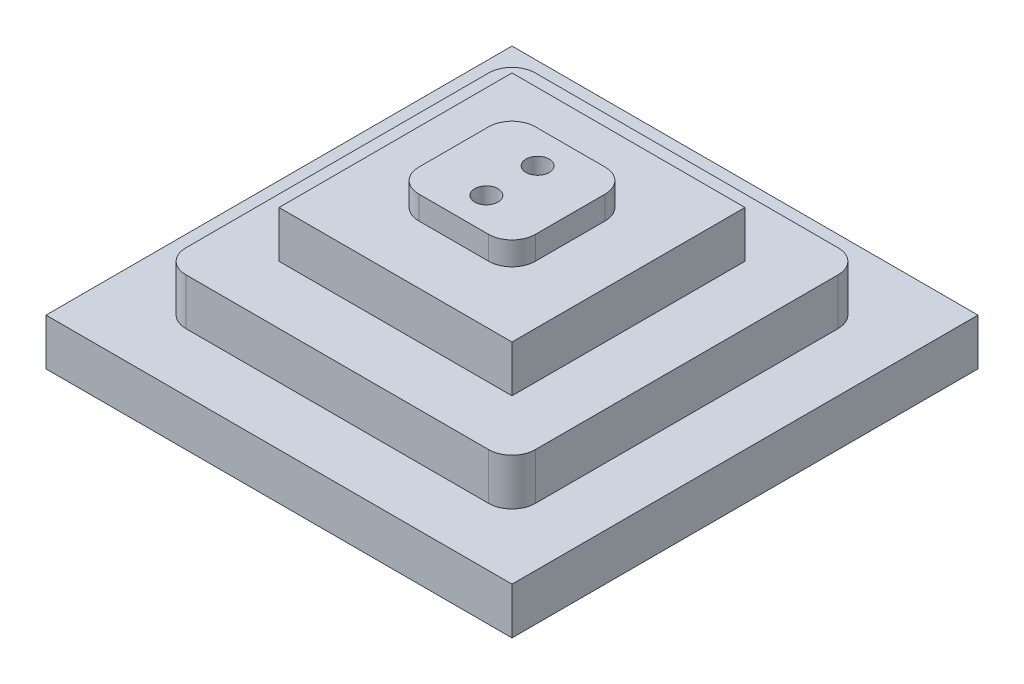
ISO-10303-21;
HEADER;
FILE_DESCRIPTION(('STEP AP214'),'2;1');
FILE_NAME('part.step','',(''),(''),'','','');
FILE_SCHEMA(('AUTOMOTIVE_DESIGN { 1 0 10303 214 1 1 1 1 }'));
ENDSEC;
DATA;
#1=APPLICATION_CONTEXT('core data for automotive mechanical design processes');
#2=APPLICATION_PROTOCOL_DEFINITION('international standard','automotive_design',2000,#1);
#3=PRODUCT_CONTEXT('',#1,'mechanical');
#4=PRODUCT('Part','Part','',(#3));
#5=PRODUCT_RELATED_PRODUCT_CATEGORY('part','',(#4));
#6=PRODUCT_DEFINITION_FORMATION('','',#4);
#7=PRODUCT_DEFINITION_CONTEXT('part definition',#1,'design');
#8=PRODUCT_DEFINITION('design','',#6,#7);
#9=PRODUCT_DEFINITION_SHAPE('','',#8);
#10=(LENGTH_UNIT() NAMED_UNIT(*) SI_UNIT(.MILLI.,.METRE.));
#11=(NAMED_UNIT(*) PLANE_ANGLE_UNIT() SI_UNIT($,.RADIAN.));
#12=(NAMED_UNIT(*) SI_UNIT($,.STERADIAN.) SOLID_ANGLE_UNIT());
#13=UNCERTAINTY_MEASURE_WITH_UNIT(LENGTH_MEASURE(1.E-05),#10,'distance_accuracy_value','');
#14=(GEOMETRIC_REPRESENTATION_CONTEXT(3) GLOBAL_UNCERTAINTY_ASSIGNED_CONTEXT((#13)) GLOBAL_UNIT_ASSIGNED_CONTEXT((#10,
#11,#12)) REPRESENTATION_CONTEXT('',''));
#15=CARTESIAN_POINT('',(0.,0.,0.));
#16=DIRECTION('',(0.,0.,1.));
#17=DIRECTION('',(1.,0.,0.));
#18=AXIS2_PLACEMENT_3D('',#15,#16,#17);
#19=CARTESIAN_POINT('',(0.,10.,0.));
#20=DIRECTION('',(0.,-1.,0.));
#21=DIRECTION('',(0.,0.,-1.));
#22=AXIS2_PLACEMENT_3D('',#19,#20,#21);
#23=PLANE('',#22);
#24=DIRECTION('',(0.,0.,1.));
#25=VECTOR('',#24,1.);
#26=CARTESIAN_POINT('',(0.,10.,0.));
#27=LINE('',#26,#25);
#28=CARTESIAN_POINT('',(0.,10.,-100.));
#29=VERTEX_POINT('',#28);
#30=CARTESIAN_POINT('',(0.,10.,0.));
#31=VERTEX_POINT('',#30);
#32=EDGE_CURVE('E267',#29,#31,#27,.T.);
#33=ORIENTED_EDGE('',*,*,#32,.T.);
#34=DIRECTION('',(1.,0.,0.));
#35=VECTOR('',#34,1.);
#36=CARTESIAN_POINT('',(0.,10.,0.));
#37=LINE('',#36,#35);
#38=CARTESIAN_POINT('',(100.,10.,0.));
#39=VERTEX_POINT('',#38);
#40=EDGE_CURVE('E271',#31,#39,#37,.T.);
#41=ORIENTED_EDGE('',*,*,#40,.T.);
#42=DIRECTION('',(0.,0.,-1.));
#43=VECTOR('',#42,1.);
#44=CARTESIAN_POINT('',(100.,10.,0.));
#45=LINE('',#44,#43);
#46=CARTESIAN_POINT('',(100.,10.,-100.));
#47=VERTEX_POINT('',#46);
#48=EDGE_CURVE('E275',#39,#47,#45,.T.);
#49=ORIENTED_EDGE('',*,*,#48,.T.);
#50=DIRECTION('',(-1.,0.,0.));
#51=VECTOR('',#50,1.);
#52=CARTESIAN_POINT('',(0.,10.,-100.));
#53=LINE('',#52,#51);
#54=EDGE_CURVE('E278',#47,#29,#53,.T.);
#55=ORIENTED_EDGE('',*,*,#54,.T.);
#56=EDGE_LOOP('',(#33,#41,#49,#55));
#57=FACE_BOUND('',#56,.T.);
#58=DIRECTION('',(0.,0.,1.));
#59=VECTOR('',#58,1.);
#60=CARTESIAN_POINT('',(12.5,10.,-12.5));
#61=LINE('',#60,#59);
#62=CARTESIAN_POINT('',(12.5,10.,-82.5));
#63=VERTEX_POINT('',#62);
#64=CARTESIAN_POINT('',(12.5,10.,-17.5));
#65=VERTEX_POINT('',#64);
#66=EDGE_CURVE('E228',#63,#65,#61,.T.);
#67=ORIENTED_EDGE('',*,*,#66,.F.);
#68=CARTESIAN_POINT('',(17.5,10.,-82.5));
#69=DIRECTION('',(0.,-1.,0.));
#70=DIRECTION('',(0.,0.,-1.));
#71=AXIS2_PLACEMENT_3D('',#68,#69,#70);
#72=CIRCLE('',#71,5.);
#73=CARTESIAN_POINT('',(17.5,10.,-87.5));
#74=VERTEX_POINT('',#73);
#75=EDGE_CURVE('E387',#63,#74,#72,.T.);
#76=ORIENTED_EDGE('',*,*,#75,.T.);
#77=DIRECTION('',(-1.,0.,0.));
#78=VECTOR('',#77,1.);
#79=CARTESIAN_POINT('',(87.5,10.,-87.5));
#80=LINE('',#79,#78);
#81=CARTESIAN_POINT('',(82.5,10.,-87.5));
#82=VERTEX_POINT('',#81);
#83=EDGE_CURVE('E244',#82,#74,#80,.T.);
#84=ORIENTED_EDGE('',*,*,#83,.F.);
#85=CARTESIAN_POINT('',(82.5,10.,-82.5));
#86=DIRECTION('',(0.,-1.,0.));
#87=DIRECTION('',(0.,0.,-1.));
#88=AXIS2_PLACEMENT_3D('',#85,#86,#87);
#89=CIRCLE('',#88,5.);
#90=CARTESIAN_POINT('',(87.5,10.,-82.5));
#91=VERTEX_POINT('',#90);
#92=EDGE_CURVE('E402',#82,#91,#89,.T.);
#93=ORIENTED_EDGE('',*,*,#92,.T.);
#94=DIRECTION('',(0.,0.,-1.));
#95=VECTOR('',#94,1.);
#96=CARTESIAN_POINT('',(87.5,10.,-12.5));
#97=LINE('',#96,#95);
#98=CARTESIAN_POINT('',(87.5,10.,-17.5));
#99=VERTEX_POINT('',#98);
#100=EDGE_CURVE('E260',#99,#91,#97,.T.);
#101=ORIENTED_EDGE('',*,*,#100,.F.);
#102=CARTESIAN_POINT('',(82.5,10.,-17.5));
#103=DIRECTION('',(0.,-1.,0.));
#104=DIRECTION('',(0.,0.,-1.));
#105=AXIS2_PLACEMENT_3D('',#102,#103,#104);
#106=CIRCLE('',#105,5.);
#107=CARTESIAN_POINT('',(82.5,10.,-12.5));
#108=VERTEX_POINT('',#107);
#109=EDGE_CURVE('E399',#99,#108,#106,.T.);
#110=ORIENTED_EDGE('',*,*,#109,.T.);
#111=DIRECTION('',(1.,0.,0.));
#112=VECTOR('',#111,1.);
#113=CARTESIAN_POINT('',(87.5,10.,-12.5));
#114=LINE('',#113,#112);
#115=CARTESIAN_POINT('',(17.5,10.,-12.5));
#116=VERTEX_POINT('',#115);
#117=EDGE_CURVE('E233',#116,#108,#114,.T.);
#118=ORIENTED_EDGE('',*,*,#117,.F.);
#119=CARTESIAN_POINT('',(17.5,10.,-17.5));
#120=DIRECTION('',(0.,-1.,0.));
#121=DIRECTION('',(0.,0.,-1.));
#122=AXIS2_PLACEMENT_3D('',#119,#120,#121);
#123=CIRCLE('',#122,5.);
#124=EDGE_CURVE('E396',#116,#65,#123,.T.);
#125=ORIENTED_EDGE('',*,*,#124,.T.);
#126=EDGE_LOOP('',(#67,#76,#84,#93,#101,#110,#118,#125));
#127=FACE_BOUND('',#126,.T.);
#128=ADVANCED_FACE('F39',(#57,#127),#23,.F.);
#129=CARTESIAN_POINT('',(0.,10.,0.));
#130=DIRECTION('',(1.,0.,0.));
#131=DIRECTION('',(0.,0.,-1.));
#132=AXIS2_PLACEMENT_3D('',#129,#130,#131);
#133=PLANE('',#132);
#134=DIRECTION('',(0.,0.,1.));
#135=VECTOR('',#134,1.);
#136=CARTESIAN_POINT('',(0.,0.,0.));
#137=LINE('',#136,#135);
#138=CARTESIAN_POINT('',(0.,0.,-100.));
#139=VERTEX_POINT('',#138);
#140=CARTESIAN_POINT('',(0.,0.,0.));
#141=VERTEX_POINT('',#140);
#142=EDGE_CURVE('E255',#139,#141,#137,.T.);
#143=ORIENTED_EDGE('',*,*,#142,.T.);
#144=DIRECTION('',(0.,-1.,0.));
#145=VECTOR('',#144,1.);
#146=CARTESIAN_POINT('',(0.,10.,0.));
#147=LINE('',#146,#145);
#148=EDGE_CURVE('E304',#31,#141,#147,.T.);
#149=ORIENTED_EDGE('',*,*,#148,.F.);
#150=ORIENTED_EDGE('',*,*,#32,.F.);
#151=DIRECTION('',(0.,-1.,0.));
#152=VECTOR('',#151,1.);
#153=CARTESIAN_POINT('',(0.,10.,-100.));
#154=LINE('',#153,#152);
#155=EDGE_CURVE('E281',#29,#139,#154,.T.);
#156=ORIENTED_EDGE('',*,*,#155,.T.);
#157=EDGE_LOOP('',(#143,#149,#150,#156));
#158=FACE_BOUND('',#157,.T.);
#159=ADVANCED_FACE('F455',(#158),#133,.F.);
#160=CARTESIAN_POINT('',(0.,10.,0.));
#161=DIRECTION('',(0.,0.,-1.));
#162=DIRECTION('',(-1.,0.,0.));
#163=AXIS2_PLACEMENT_3D('',#160,#161,#162);
#164=PLANE('',#163);
#165=DIRECTION('',(1.,0.,0.));
#166=VECTOR('',#165,1.);
#167=CARTESIAN_POINT('',(0.,0.,0.));
#168=LINE('',#167,#166);
#169=CARTESIAN_POINT('',(100.,0.,0.));
#170=VERTEX_POINT('',#169);
#171=EDGE_CURVE('E285',#141,#170,#168,.T.);
#172=ORIENTED_EDGE('',*,*,#171,.T.);
#173=DIRECTION('',(0.,-1.,0.));
#174=VECTOR('',#173,1.);
#175=CARTESIAN_POINT('',(100.,10.,0.));
#176=LINE('',#175,#174);
#177=EDGE_CURVE('E300',#39,#170,#176,.T.);
#178=ORIENTED_EDGE('',*,*,#177,.F.);
#179=ORIENTED_EDGE('',*,*,#40,.F.);
#180=ORIENTED_EDGE('',*,*,#148,.T.);
#181=EDGE_LOOP('',(#172,#178,#179,#180));
#182=FACE_BOUND('',#181,.T.);
#183=ADVANCED_FACE('F461',(#182),#164,.F.);
#184=CARTESIAN_POINT('',(100.,10.,0.));
#185=DIRECTION('',(-1.,0.,0.));
#186=DIRECTION('',(0.,0.,1.));
#187=AXIS2_PLACEMENT_3D('',#184,#185,#186);
#188=PLANE('',#187);
#189=DIRECTION('',(0.,0.,-1.));
#190=VECTOR('',#189,1.);
#191=CARTESIAN_POINT('',(100.,0.,0.));
#192=LINE('',#191,#190);
#193=CARTESIAN_POINT('',(100.,0.,-100.));
#194=VERTEX_POINT('',#193);
#195=EDGE_CURVE('E288',#170,#194,#192,.T.);
#196=ORIENTED_EDGE('',*,*,#195,.T.);
#197=DIRECTION('',(0.,-1.,0.));
#198=VECTOR('',#197,1.);
#199=CARTESIAN_POINT('',(100.,10.,-100.));
#200=LINE('',#199,#198);
#201=EDGE_CURVE('E296',#47,#194,#200,.T.);
#202=ORIENTED_EDGE('',*,*,#201,.F.);
#203=ORIENTED_EDGE('',*,*,#48,.F.);
#204=ORIENTED_EDGE('',*,*,#177,.T.);
#205=EDGE_LOOP('',(#196,#202,#203,#204));
#206=FACE_BOUND('',#205,.T.);
#207=ADVANCED_FACE('F474',(#206),#188,.F.);
#208=CARTESIAN_POINT('',(0.,10.,-100.));
#209=DIRECTION('',(0.,0.,1.));
#210=DIRECTION('',(1.,0.,0.));
#211=AXIS2_PLACEMENT_3D('',#208,#209,#210);
#212=PLANE('',#211);
#213=DIRECTION('',(-1.,0.,0.));
#214=VECTOR('',#213,1.);
#215=CARTESIAN_POINT('',(0.,0.,-100.));
#216=LINE('',#215,#214);
#217=EDGE_CURVE('E272',#194,#139,#216,.T.);
#218=ORIENTED_EDGE('',*,*,#217,.T.);
#219=ORIENTED_EDGE('',*,*,#155,.F.);
#220=ORIENTED_EDGE('',*,*,#54,.F.);
#221=ORIENTED_EDGE('',*,*,#201,.T.);
#222=EDGE_LOOP('',(#218,#219,#220,#221));
#223=FACE_BOUND('',#222,.T.);
#224=ADVANCED_FACE('F470',(#223),#212,.F.);
#225=CARTESIAN_POINT('',(0.,0.,0.));
#226=DIRECTION('',(0.,-1.,0.));
#227=DIRECTION('',(0.,0.,-1.));
#228=AXIS2_PLACEMENT_3D('',#225,#226,#227);
#229=PLANE('',#228);
#230=CARTESIAN_POINT('',(50.,0.,-55.5));
#231=DIRECTION('',(0.,1.,0.));
#232=DIRECTION('',(0.,0.,1.));
#233=AXIS2_PLACEMENT_3D('',#230,#231,#232);
#234=CIRCLE('',#233,1.5);
#235=CARTESIAN_POINT('',(50.,0.,-54.));
#236=VERTEX_POINT('',#235);
#237=EDGE_CURVE('E839',#236,#236,#234,.T.);
#238=ORIENTED_EDGE('',*,*,#237,.T.);
#239=EDGE_LOOP('',(#238));
#240=FACE_BOUND('',#239,.T.);
#241=CARTESIAN_POINT('',(50.,0.,-44.5));
#242=DIRECTION('',(0.,1.,0.));
#243=DIRECTION('',(0.,0.,1.));
#244=AXIS2_PLACEMENT_3D('',#241,#242,#243);
#245=CIRCLE('',#244,1.5);
#246=CARTESIAN_POINT('',(50.,0.,-43.));
#247=VERTEX_POINT('',#246);
#248=EDGE_CURVE('E844',#247,#247,#245,.T.);
#249=ORIENTED_EDGE('',*,*,#248,.T.);
#250=EDGE_LOOP('',(#249));
#251=FACE_BOUND('',#250,.T.);
#252=ORIENTED_EDGE('',*,*,#142,.F.);
#253=ORIENTED_EDGE('',*,*,#217,.F.);
#254=ORIENTED_EDGE('',*,*,#195,.F.);
#255=ORIENTED_EDGE('',*,*,#171,.F.);
#256=EDGE_LOOP('',(#252,#253,#254,#255));
#257=FACE_BOUND('',#256,.T.);
#258=ADVANCED_FACE('F467',(#240,#251,#257),#229,.T.);
#259=CARTESIAN_POINT('',(12.5,20.,-12.5));
#260=DIRECTION('',(1.,0.,0.));
#261=DIRECTION('',(0.,0.,-1.));
#262=AXIS2_PLACEMENT_3D('',#259,#260,#261);
#263=PLANE('',#262);
#264=DIRECTION('',(0.,0.,1.));
#265=VECTOR('',#264,1.);
#266=CARTESIAN_POINT('',(12.5,20.,-12.5));
#267=LINE('',#266,#265);
#268=CARTESIAN_POINT('',(12.5,20.,-82.5));
#269=VERTEX_POINT('',#268);
#270=CARTESIAN_POINT('',(12.5,20.,-17.5));
#271=VERTEX_POINT('',#270);
#272=EDGE_CURVE('E239',#269,#271,#267,.T.);
#273=ORIENTED_EDGE('',*,*,#272,.F.);
#274=DIRECTION('',(0.,-1.,0.));
#275=VECTOR('',#274,1.);
#276=CARTESIAN_POINT('',(12.5,20.,-82.5));
#277=LINE('',#276,#275);
#278=EDGE_CURVE('E311',#269,#63,#277,.T.);
#279=ORIENTED_EDGE('',*,*,#278,.T.);
#280=ORIENTED_EDGE('',*,*,#66,.T.);
#281=DIRECTION('',(0.,-1.,0.));
#282=VECTOR('',#281,1.);
#283=CARTESIAN_POINT('',(12.5,20.,-17.5));
#284=LINE('',#283,#282);
#285=EDGE_CURVE('E308',#65,#271,#284,.F.);
#286=ORIENTED_EDGE('',*,*,#285,.T.);
#287=EDGE_LOOP('',(#273,#279,#280,#286));
#288=FACE_BOUND('',#287,.T.);
#289=ADVANCED_FACE('F431',(#288),#263,.F.);
#290=CARTESIAN_POINT('',(87.5,20.,-12.5));
#291=DIRECTION('',(0.,0.,-1.));
#292=DIRECTION('',(-1.,0.,0.));
#293=AXIS2_PLACEMENT_3D('',#290,#291,#292);
#294=PLANE('',#293);
#295=DIRECTION('',(1.,0.,0.));
#296=VECTOR('',#295,1.);
#297=CARTESIAN_POINT('',(87.5,20.,-12.5));
#298=LINE('',#297,#296);
#299=CARTESIAN_POINT('',(17.5,20.,-12.5));
#300=VERTEX_POINT('',#299);
#301=CARTESIAN_POINT('',(82.5,20.,-12.5));
#302=VERTEX_POINT('',#301);
#303=EDGE_CURVE('E243',#300,#302,#298,.T.);
#304=ORIENTED_EDGE('',*,*,#303,.F.);
#305=DIRECTION('',(0.,-1.,0.));
#306=VECTOR('',#305,1.);
#307=CARTESIAN_POINT('',(17.5,20.,-12.5));
#308=LINE('',#307,#306);
#309=EDGE_CURVE('E370',#300,#116,#308,.T.);
#310=ORIENTED_EDGE('',*,*,#309,.T.);
#311=ORIENTED_EDGE('',*,*,#117,.T.);
#312=DIRECTION('',(0.,-1.,0.));
#313=VECTOR('',#312,1.);
#314=CARTESIAN_POINT('',(82.5,20.,-12.5));
#315=LINE('',#314,#313);
#316=EDGE_CURVE('E367',#108,#302,#315,.F.);
#317=ORIENTED_EDGE('',*,*,#316,.T.);
#318=EDGE_LOOP('',(#304,#310,#311,#317));
#319=FACE_BOUND('',#318,.T.);
#320=ADVANCED_FACE('F439',(#319),#294,.F.);
#321=CARTESIAN_POINT('',(87.5,20.,-12.5));
#322=DIRECTION('',(-1.,0.,0.));
#323=DIRECTION('',(0.,0.,1.));
#324=AXIS2_PLACEMENT_3D('',#321,#322,#323);
#325=PLANE('',#324);
#326=DIRECTION('',(0.,0.,-1.));
#327=VECTOR('',#326,1.);
#328=CARTESIAN_POINT('',(87.5,20.,-12.5));
#329=LINE('',#328,#327);
#330=CARTESIAN_POINT('',(87.5,20.,-17.5));
#331=VERTEX_POINT('',#330);
#332=CARTESIAN_POINT('',(87.5,20.,-82.5));
#333=VERTEX_POINT('',#332);
#334=EDGE_CURVE('E248',#331,#333,#329,.T.);
#335=ORIENTED_EDGE('',*,*,#334,.F.);
#336=DIRECTION('',(0.,-1.,0.));
#337=VECTOR('',#336,1.);
#338=CARTESIAN_POINT('',(87.5,20.,-17.5));
#339=LINE('',#338,#337);
#340=EDGE_CURVE('E377',#331,#99,#339,.T.);
#341=ORIENTED_EDGE('',*,*,#340,.T.);
#342=ORIENTED_EDGE('',*,*,#100,.T.);
#343=DIRECTION('',(0.,-1.,0.));
#344=VECTOR('',#343,1.);
#345=CARTESIAN_POINT('',(87.5,20.,-82.5));
#346=LINE('',#345,#344);
#347=EDGE_CURVE('E374',#91,#333,#346,.F.);
#348=ORIENTED_EDGE('',*,*,#347,.T.);
#349=EDGE_LOOP('',(#335,#341,#342,#348));
#350=FACE_BOUND('',#349,.T.);
#351=ADVANCED_FACE('F414',(#350),#325,.F.);
#352=CARTESIAN_POINT('',(87.5,20.,-87.5));
#353=DIRECTION('',(0.,0.,1.));
#354=DIRECTION('',(1.,0.,0.));
#355=AXIS2_PLACEMENT_3D('',#352,#353,#354);
#356=PLANE('',#355);
#357=ORIENTED_EDGE('',*,*,#83,.T.);
#358=DIRECTION('',(0.,-1.,0.));
#359=VECTOR('',#358,1.);
#360=CARTESIAN_POINT('',(17.5,20.,-87.5));
#361=LINE('',#360,#359);
#362=CARTESIAN_POINT('',(17.5,20.,-87.5));
#363=VERTEX_POINT('',#362);
#364=EDGE_CURVE('E319',#74,#363,#361,.F.);
#365=ORIENTED_EDGE('',*,*,#364,.T.);
#366=DIRECTION('',(-1.,0.,0.));
#367=VECTOR('',#366,1.);
#368=CARTESIAN_POINT('',(87.5,20.,-87.5));
#369=LINE('',#368,#367);
#370=CARTESIAN_POINT('',(82.5,20.,-87.5));
#371=VERTEX_POINT('',#370);
#372=EDGE_CURVE('E252',#371,#363,#369,.T.);
#373=ORIENTED_EDGE('',*,*,#372,.F.);
#374=DIRECTION('',(0.,-1.,0.));
#375=VECTOR('',#374,1.);
#376=CARTESIAN_POINT('',(82.5,20.,-87.5));
#377=LINE('',#376,#375);
#378=EDGE_CURVE('E315',#371,#82,#377,.T.);
#379=ORIENTED_EDGE('',*,*,#378,.T.);
#380=EDGE_LOOP('',(#357,#365,#373,#379));
#381=FACE_BOUND('',#380,.T.);
#382=ADVANCED_FACE('F423',(#381),#356,.F.);
#383=CARTESIAN_POINT('',(0.,20.,0.));
#384=DIRECTION('',(0.,1.,0.));
#385=DIRECTION('',(0.,0.,1.));
#386=AXIS2_PLACEMENT_3D('',#383,#384,#385);
#387=PLANE('',#386);
#388=DIRECTION('',(0.,0.,1.));
#389=VECTOR('',#388,1.);
#390=CARTESIAN_POINT('',(25.,20.,-25.));
#391=LINE('',#390,#389);
#392=CARTESIAN_POINT('',(25.,20.,-75.));
#393=VERTEX_POINT('',#392);
#394=CARTESIAN_POINT('',(25.,20.,-25.));
#395=VERTEX_POINT('',#394);
#396=EDGE_CURVE('E226',#393,#395,#391,.T.);
#397=ORIENTED_EDGE('',*,*,#396,.F.);
#398=DIRECTION('',(-1.,0.,0.));
#399=VECTOR('',#398,1.);
#400=CARTESIAN_POINT('',(75.,20.,-75.));
#401=LINE('',#400,#399);
#402=CARTESIAN_POINT('',(75.,20.,-75.));
#403=VERTEX_POINT('',#402);
#404=EDGE_CURVE('E223',#403,#393,#401,.T.);
#405=ORIENTED_EDGE('',*,*,#404,.F.);
#406=DIRECTION('',(0.,0.,-1.));
#407=VECTOR('',#406,1.);
#408=CARTESIAN_POINT('',(75.,20.,-25.));
#409=LINE('',#408,#407);
#410=CARTESIAN_POINT('',(75.,20.,-25.));
#411=VERTEX_POINT('',#410);
#412=EDGE_CURVE('E548',#411,#403,#409,.T.);
#413=ORIENTED_EDGE('',*,*,#412,.F.);
#414=DIRECTION('',(1.,0.,0.));
#415=VECTOR('',#414,1.);
#416=CARTESIAN_POINT('',(75.,20.,-25.));
#417=LINE('',#416,#415);
#418=EDGE_CURVE('E545',#395,#411,#417,.T.);
#419=ORIENTED_EDGE('',*,*,#418,.F.);
#420=EDGE_LOOP('',(#397,#405,#413,#419));
#421=FACE_BOUND('',#420,.T.);
#422=ORIENTED_EDGE('',*,*,#372,.T.);
#423=CARTESIAN_POINT('',(17.5,20.,-82.5));
#424=DIRECTION('',(0.,1.,0.));
#425=DIRECTION('',(0.,0.,1.));
#426=AXIS2_PLACEMENT_3D('',#423,#424,#425);
#427=CIRCLE('',#426,5.);
#428=EDGE_CURVE('E331',#363,#269,#427,.T.);
#429=ORIENTED_EDGE('',*,*,#428,.T.);
#430=ORIENTED_EDGE('',*,*,#272,.T.);
#431=CARTESIAN_POINT('',(17.5,20.,-17.5));
#432=DIRECTION('',(0.,1.,0.));
#433=DIRECTION('',(0.,0.,1.));
#434=AXIS2_PLACEMENT_3D('',#431,#432,#433);
#435=CIRCLE('',#434,5.);
#436=EDGE_CURVE('E328',#271,#300,#435,.T.);
#437=ORIENTED_EDGE('',*,*,#436,.T.);
#438=ORIENTED_EDGE('',*,*,#303,.T.);
#439=CARTESIAN_POINT('',(82.5,20.,-17.5));
#440=DIRECTION('',(0.,1.,0.));
#441=DIRECTION('',(0.,0.,1.));
#442=AXIS2_PLACEMENT_3D('',#439,#440,#441);
#443=CIRCLE('',#442,5.);
#444=EDGE_CURVE('E325',#302,#331,#443,.T.);
#445=ORIENTED_EDGE('',*,*,#444,.T.);
#446=ORIENTED_EDGE('',*,*,#334,.T.);
#447=CARTESIAN_POINT('',(82.5,20.,-82.5));
#448=DIRECTION('',(0.,1.,0.));
#449=DIRECTION('',(0.,0.,1.));
#450=AXIS2_PLACEMENT_3D('',#447,#448,#449);
#451=CIRCLE('',#450,5.);
#452=EDGE_CURVE('E322',#333,#371,#451,.T.);
#453=ORIENTED_EDGE('',*,*,#452,.T.);
#454=EDGE_LOOP('',(#422,#429,#430,#437,#438,#445,#446,#453));
#455=FACE_BOUND('',#454,.T.);
#456=ADVANCED_FACE('F420',(#421,#455),#387,.T.);
#457=CARTESIAN_POINT('',(25.,30.,-25.));
#458=DIRECTION('',(1.,0.,0.));
#459=DIRECTION('',(0.,0.,-1.));
#460=AXIS2_PLACEMENT_3D('',#457,#458,#459);
#461=PLANE('',#460);
#462=ORIENTED_EDGE('',*,*,#396,.T.);
#463=DIRECTION('',(0.,-1.,0.));
#464=VECTOR('',#463,1.);
#465=CARTESIAN_POINT('',(25.,30.,-25.));
#466=LINE('',#465,#464);
#467=CARTESIAN_POINT('',(25.,30.,-25.));
#468=VERTEX_POINT('',#467);
#469=EDGE_CURVE('E205',#468,#395,#466,.T.);
#470=ORIENTED_EDGE('',*,*,#469,.F.);
#471=DIRECTION('',(0.,0.,1.));
#472=VECTOR('',#471,1.);
#473=CARTESIAN_POINT('',(25.,30.,-25.));
#474=LINE('',#473,#472);
#475=CARTESIAN_POINT('',(25.,30.,-75.));
#476=VERTEX_POINT('',#475);
#477=EDGE_CURVE('E213',#476,#468,#474,.T.);
#478=ORIENTED_EDGE('',*,*,#477,.F.);
#479=DIRECTION('',(0.,-1.,0.));
#480=VECTOR('',#479,1.);
#481=CARTESIAN_POINT('',(25.,30.,-75.));
#482=LINE('',#481,#480);
#483=EDGE_CURVE('E542',#476,#393,#482,.T.);
#484=ORIENTED_EDGE('',*,*,#483,.T.);
#485=EDGE_LOOP('',(#462,#470,#478,#484));
#486=FACE_BOUND('',#485,.T.);
#487=ADVANCED_FACE('F225',(#486),#461,.F.);
#488=CARTESIAN_POINT('',(75.,30.,-25.));
#489=DIRECTION('',(0.,0.,-1.));
#490=DIRECTION('',(-1.,0.,0.));
#491=AXIS2_PLACEMENT_3D('',#488,#489,#490);
#492=PLANE('',#491);
#493=ORIENTED_EDGE('',*,*,#418,.T.);
#494=DIRECTION('',(0.,-1.,0.));
#495=VECTOR('',#494,1.);
#496=CARTESIAN_POINT('',(75.,30.,-25.));
#497=LINE('',#496,#495);
#498=CARTESIAN_POINT('',(75.,30.,-25.));
#499=VERTEX_POINT('',#498);
#500=EDGE_CURVE('E208',#499,#411,#497,.T.);
#501=ORIENTED_EDGE('',*,*,#500,.F.);
#502=DIRECTION('',(1.,0.,0.));
#503=VECTOR('',#502,1.);
#504=CARTESIAN_POINT('',(75.,30.,-25.));
#505=LINE('',#504,#503);
#506=EDGE_CURVE('E200',#468,#499,#505,.T.);
#507=ORIENTED_EDGE('',*,*,#506,.F.);
#508=ORIENTED_EDGE('',*,*,#469,.T.);
#509=EDGE_LOOP('',(#493,#501,#507,#508));
#510=FACE_BOUND('',#509,.T.);
#511=ADVANCED_FACE('F203',(#510),#492,.F.);
#512=CARTESIAN_POINT('',(75.,30.,-25.));
#513=DIRECTION('',(-1.,0.,0.));
#514=DIRECTION('',(0.,0.,1.));
#515=AXIS2_PLACEMENT_3D('',#512,#513,#514);
#516=PLANE('',#515);
#517=ORIENTED_EDGE('',*,*,#412,.T.);
#518=DIRECTION('',(0.,-1.,0.));
#519=VECTOR('',#518,1.);
#520=CARTESIAN_POINT('',(75.,30.,-75.));
#521=LINE('',#520,#519);
#522=CARTESIAN_POINT('',(75.,30.,-75.));
#523=VERTEX_POINT('',#522);
#524=EDGE_CURVE('E235',#523,#403,#521,.T.);
#525=ORIENTED_EDGE('',*,*,#524,.F.);
#526=DIRECTION('',(0.,0.,-1.));
#527=VECTOR('',#526,1.);
#528=CARTESIAN_POINT('',(75.,30.,-25.));
#529=LINE('',#528,#527);
#530=EDGE_CURVE('E212',#499,#523,#529,.T.);
#531=ORIENTED_EDGE('',*,*,#530,.F.);
#532=ORIENTED_EDGE('',*,*,#500,.T.);
#533=EDGE_LOOP('',(#517,#525,#531,#532));
#534=FACE_BOUND('',#533,.T.);
#535=ADVANCED_FACE('F562',(#534),#516,.F.);
#536=CARTESIAN_POINT('',(75.,30.,-75.));
#537=DIRECTION('',(0.,0.,1.));
#538=DIRECTION('',(1.,0.,0.));
#539=AXIS2_PLACEMENT_3D('',#536,#537,#538);
#540=PLANE('',#539);
#541=ORIENTED_EDGE('',*,*,#404,.T.);
#542=ORIENTED_EDGE('',*,*,#483,.F.);
#543=DIRECTION('',(-1.,0.,0.));
#544=VECTOR('',#543,1.);
#545=CARTESIAN_POINT('',(75.,30.,-75.));
#546=LINE('',#545,#544);
#547=EDGE_CURVE('E218',#523,#476,#546,.T.);
#548=ORIENTED_EDGE('',*,*,#547,.F.);
#549=ORIENTED_EDGE('',*,*,#524,.T.);
#550=EDGE_LOOP('',(#541,#542,#548,#549));
#551=FACE_BOUND('',#550,.T.);
#552=ADVANCED_FACE('F560',(#551),#540,.F.);
#553=CARTESIAN_POINT('',(0.,30.,0.));
#554=DIRECTION('',(0.,1.,0.));
#555=DIRECTION('',(0.,0.,1.));
#556=AXIS2_PLACEMENT_3D('',#553,#554,#555);
#557=PLANE('',#556);
#558=DIRECTION('',(0.,0.,1.));
#559=VECTOR('',#558,1.);
#560=CARTESIAN_POINT('',(37.5,30.,-37.5));
#561=LINE('',#560,#559);
#562=CARTESIAN_POINT('',(37.5,30.,-57.5));
#563=VERTEX_POINT('',#562);
#564=CARTESIAN_POINT('',(37.5,30.,-42.5));
#565=VERTEX_POINT('',#564);
#566=EDGE_CURVE('E524',#563,#565,#561,.T.);
#567=ORIENTED_EDGE('',*,*,#566,.F.);
#568=CARTESIAN_POINT('',(42.5,30.,-57.5));
#569=DIRECTION('',(0.,1.,0.));
#570=DIRECTION('',(0.,0.,1.));
#571=AXIS2_PLACEMENT_3D('',#568,#569,#570);
#572=CIRCLE('',#571,5.);
#573=CARTESIAN_POINT('',(42.5,30.,-62.5));
#574=VERTEX_POINT('',#573);
#575=EDGE_CURVE('E390',#563,#574,#572,.F.);
#576=ORIENTED_EDGE('',*,*,#575,.T.);
#577=DIRECTION('',(-1.,0.,0.));
#578=VECTOR('',#577,1.);
#579=CARTESIAN_POINT('',(62.5,30.,-62.5));
#580=LINE('',#579,#578);
#581=CARTESIAN_POINT('',(57.5,30.,-62.5));
#582=VERTEX_POINT('',#581);
#583=EDGE_CURVE('E518',#582,#574,#580,.T.);
#584=ORIENTED_EDGE('',*,*,#583,.F.);
#585=CARTESIAN_POINT('',(57.5,30.,-57.5));
#586=DIRECTION('',(0.,1.,0.));
#587=DIRECTION('',(0.,0.,1.));
#588=AXIS2_PLACEMENT_3D('',#585,#586,#587);
#589=CIRCLE('',#588,5.);
#590=CARTESIAN_POINT('',(62.5,30.,-57.5));
#591=VERTEX_POINT('',#590);
#592=EDGE_CURVE('E48',#582,#591,#589,.F.);
#593=ORIENTED_EDGE('',*,*,#592,.T.);
#594=DIRECTION('',(0.,0.,-1.));
#595=VECTOR('',#594,1.);
#596=CARTESIAN_POINT('',(62.5,30.,-37.5));
#597=LINE('',#596,#595);
#598=CARTESIAN_POINT('',(62.5,30.,-42.5));
#599=VERTEX_POINT('',#598);
#600=EDGE_CURVE('E532',#599,#591,#597,.T.);
#601=ORIENTED_EDGE('',*,*,#600,.F.);
#602=CARTESIAN_POINT('',(57.5,30.,-42.5));
#603=DIRECTION('',(0.,1.,0.));
#604=DIRECTION('',(0.,0.,1.));
#605=AXIS2_PLACEMENT_3D('',#602,#603,#604);
#606=CIRCLE('',#605,5.);
#607=CARTESIAN_POINT('',(57.5,30.,-37.5));
#608=VERTEX_POINT('',#607);
#609=EDGE_CURVE('E11',#599,#608,#606,.F.);
#610=ORIENTED_EDGE('',*,*,#609,.T.);
#611=DIRECTION('',(1.,0.,0.));
#612=VECTOR('',#611,1.);
#613=CARTESIAN_POINT('',(62.5,30.,-37.5));
#614=LINE('',#613,#612);
#615=CARTESIAN_POINT('',(42.5,30.,-37.5));
#616=VERTEX_POINT('',#615);
#617=EDGE_CURVE('E528',#616,#608,#614,.T.);
#618=ORIENTED_EDGE('',*,*,#617,.F.);
#619=CARTESIAN_POINT('',(42.5,30.,-42.5));
#620=DIRECTION('',(0.,1.,0.));
#621=DIRECTION('',(0.,0.,1.));
#622=AXIS2_PLACEMENT_3D('',#619,#620,#621);
#623=CIRCLE('',#622,5.);
#624=EDGE_CURVE('E393',#616,#565,#623,.F.);
#625=ORIENTED_EDGE('',*,*,#624,.T.);
#626=EDGE_LOOP('',(#567,#576,#584,#593,#601,#610,#618,#625));
#627=FACE_BOUND('',#626,.T.);
#628=ORIENTED_EDGE('',*,*,#477,.T.);
#629=ORIENTED_EDGE('',*,*,#506,.T.);
#630=ORIENTED_EDGE('',*,*,#530,.T.);
#631=ORIENTED_EDGE('',*,*,#547,.T.);
#632=EDGE_LOOP('',(#628,#629,#630,#631));
#633=FACE_BOUND('',#632,.T.);
#634=ADVANCED_FACE('F216',(#627,#633),#557,.T.);
#635=CARTESIAN_POINT('',(37.5,35.,-37.5));
#636=DIRECTION('',(1.,0.,0.));
#637=DIRECTION('',(0.,0.,-1.));
#638=AXIS2_PLACEMENT_3D('',#635,#636,#637);
#639=PLANE('',#638);
#640=DIRECTION('',(0.,0.,1.));
#641=VECTOR('',#640,1.);
#642=CARTESIAN_POINT('',(37.5,35.,-37.5));
#643=LINE('',#642,#641);
#644=CARTESIAN_POINT('',(37.5,35.,-57.5));
#645=VERTEX_POINT('',#644);
#646=CARTESIAN_POINT('',(37.5,35.,-42.5));
#647=VERTEX_POINT('',#646);
#648=EDGE_CURVE('E505',#645,#647,#643,.T.);
#649=ORIENTED_EDGE('',*,*,#648,.F.);
#650=DIRECTION('',(0.,-1.,0.));
#651=VECTOR('',#650,1.);
#652=CARTESIAN_POINT('',(37.5,35.,-57.5));
#653=LINE('',#652,#651);
#654=EDGE_CURVE('E337',#645,#563,#653,.T.);
#655=ORIENTED_EDGE('',*,*,#654,.T.);
#656=ORIENTED_EDGE('',*,*,#566,.T.);
#657=DIRECTION('',(0.,-1.,0.));
#658=VECTOR('',#657,1.);
#659=CARTESIAN_POINT('',(37.5,35.,-42.5));
#660=LINE('',#659,#658);
#661=EDGE_CURVE('E334',#565,#647,#660,.F.);
#662=ORIENTED_EDGE('',*,*,#661,.T.);
#663=EDGE_LOOP('',(#649,#655,#656,#662));
#664=FACE_BOUND('',#663,.T.);
#665=ADVANCED_FACE('F672',(#664),#639,.F.);
#666=CARTESIAN_POINT('',(62.5,35.,-37.5));
#667=DIRECTION('',(0.,0.,-1.));
#668=DIRECTION('',(-1.,0.,0.));
#669=AXIS2_PLACEMENT_3D('',#666,#667,#668);
#670=PLANE('',#669);
#671=DIRECTION('',(1.,0.,0.));
#672=VECTOR('',#671,1.);
#673=CARTESIAN_POINT('',(62.5,35.,-37.5));
#674=LINE('',#673,#672);
#675=CARTESIAN_POINT('',(42.5,35.,-37.5));
#676=VERTEX_POINT('',#675);
#677=CARTESIAN_POINT('',(57.5,35.,-37.5));
#678=VERTEX_POINT('',#677);
#679=EDGE_CURVE('E502',#676,#678,#674,.T.);
#680=ORIENTED_EDGE('',*,*,#679,.F.);
#681=DIRECTION('',(0.,-1.,0.));
#682=VECTOR('',#681,1.);
#683=CARTESIAN_POINT('',(42.5,35.,-37.5));
#684=LINE('',#683,#682);
#685=EDGE_CURVE('E363',#676,#616,#684,.T.);
#686=ORIENTED_EDGE('',*,*,#685,.T.);
#687=ORIENTED_EDGE('',*,*,#617,.T.);
#688=DIRECTION('',(0.,-1.,0.));
#689=VECTOR('',#688,1.);
#690=CARTESIAN_POINT('',(57.5,35.,-37.5));
#691=LINE('',#690,#689);
#692=EDGE_CURVE('E360',#608,#678,#691,.F.);
#693=ORIENTED_EDGE('',*,*,#692,.T.);
#694=EDGE_LOOP('',(#680,#686,#687,#693));
#695=FACE_BOUND('',#694,.T.);
#696=ADVANCED_FACE('F507',(#695),#670,.F.);
#697=CARTESIAN_POINT('',(62.5,35.,-37.5));
#698=DIRECTION('',(-1.,0.,0.));
#699=DIRECTION('',(0.,0.,1.));
#700=AXIS2_PLACEMENT_3D('',#697,#698,#699);
#701=PLANE('',#700);
#702=ORIENTED_EDGE('',*,*,#600,.T.);
#703=DIRECTION('',(0.,-1.,0.));
#704=VECTOR('',#703,1.);
#705=CARTESIAN_POINT('',(62.5,35.,-57.5));
#706=LINE('',#705,#704);
#707=CARTESIAN_POINT('',(62.5,35.,-57.5));
#708=VERTEX_POINT('',#707);
#709=EDGE_CURVE('E384',#591,#708,#706,.F.);
#710=ORIENTED_EDGE('',*,*,#709,.T.);
#711=DIRECTION('',(0.,0.,-1.));
#712=VECTOR('',#711,1.);
#713=CARTESIAN_POINT('',(62.5,35.,-37.5));
#714=LINE('',#713,#712);
#715=CARTESIAN_POINT('',(62.5,35.,-42.5));
#716=VERTEX_POINT('',#715);
#717=EDGE_CURVE('E511',#716,#708,#714,.T.);
#718=ORIENTED_EDGE('',*,*,#717,.F.);
#719=DIRECTION('',(0.,-1.,0.));
#720=VECTOR('',#719,1.);
#721=CARTESIAN_POINT('',(62.5,35.,-42.5));
#722=LINE('',#721,#720);
#723=EDGE_CURVE('E381',#716,#599,#722,.T.);
#724=ORIENTED_EDGE('',*,*,#723,.T.);
#725=EDGE_LOOP('',(#702,#710,#718,#724));
#726=FACE_BOUND('',#725,.T.);
#727=ADVANCED_FACE('F688',(#726),#701,.F.);
#728=CARTESIAN_POINT('',(62.5,35.,-62.5));
#729=DIRECTION('',(0.,0.,1.));
#730=DIRECTION('',(1.,0.,0.));
#731=AXIS2_PLACEMENT_3D('',#728,#729,#730);
#732=PLANE('',#731);
#733=ORIENTED_EDGE('',*,*,#583,.T.);
#734=DIRECTION('',(0.,-1.,0.));
#735=VECTOR('',#734,1.);
#736=CARTESIAN_POINT('',(42.5,35.,-62.5));
#737=LINE('',#736,#735);
#738=CARTESIAN_POINT('',(42.5,35.,-62.5));
#739=VERTEX_POINT('',#738);
#740=EDGE_CURVE('E345',#574,#739,#737,.F.);
#741=ORIENTED_EDGE('',*,*,#740,.T.);
#742=DIRECTION('',(-1.,0.,0.));
#743=VECTOR('',#742,1.);
#744=CARTESIAN_POINT('',(62.5,35.,-62.5));
#745=LINE('',#744,#743);
#746=CARTESIAN_POINT('',(57.5,35.,-62.5));
#747=VERTEX_POINT('',#746);
#748=EDGE_CURVE('E516',#747,#739,#745,.T.);
#749=ORIENTED_EDGE('',*,*,#748,.F.);
#750=DIRECTION('',(0.,-1.,0.));
#751=VECTOR('',#750,1.);
#752=CARTESIAN_POINT('',(57.5,35.,-62.5));
#753=LINE('',#752,#751);
#754=EDGE_CURVE('E341',#747,#582,#753,.T.);
#755=ORIENTED_EDGE('',*,*,#754,.T.);
#756=EDGE_LOOP('',(#733,#741,#749,#755));
#757=FACE_BOUND('',#756,.T.);
#758=ADVANCED_FACE('F696',(#757),#732,.F.);
#759=CARTESIAN_POINT('',(0.,35.,0.));
#760=DIRECTION('',(0.,1.,0.));
#761=DIRECTION('',(0.,0.,1.));
#762=AXIS2_PLACEMENT_3D('',#759,#760,#761);
#763=PLANE('',#762);
#764=CARTESIAN_POINT('',(50.,35.,-55.5));
#765=DIRECTION('',(0.,1.,0.));
#766=DIRECTION('',(0.,0.,1.));
#767=AXIS2_PLACEMENT_3D('',#764,#765,#766);
#768=CIRCLE('',#767,2.5);
#769=CARTESIAN_POINT('',(50.,35.,-53.));
#770=VERTEX_POINT('',#769);
#771=EDGE_CURVE('E860',#770,#770,#768,.T.);
#772=ORIENTED_EDGE('',*,*,#771,.F.);
#773=EDGE_LOOP('',(#772));
#774=FACE_BOUND('',#773,.T.);
#775=CARTESIAN_POINT('',(50.,35.,-44.5));
#776=DIRECTION('',(0.,1.,0.));
#777=DIRECTION('',(0.,0.,1.));
#778=AXIS2_PLACEMENT_3D('',#775,#776,#777);
#779=CIRCLE('',#778,2.5);
#780=CARTESIAN_POINT('',(50.,35.,-42.));
#781=VERTEX_POINT('',#780);
#782=EDGE_CURVE('E848',#781,#781,#779,.T.);
#783=ORIENTED_EDGE('',*,*,#782,.F.);
#784=EDGE_LOOP('',(#783));
#785=FACE_BOUND('',#784,.T.);
#786=ORIENTED_EDGE('',*,*,#748,.T.);
#787=CARTESIAN_POINT('',(42.5,35.,-57.5));
#788=DIRECTION('',(0.,1.,0.));
#789=DIRECTION('',(0.,0.,1.));
#790=AXIS2_PLACEMENT_3D('',#787,#788,#789);
#791=CIRCLE('',#790,5.);
#792=EDGE_CURVE('E357',#739,#645,#791,.T.);
#793=ORIENTED_EDGE('',*,*,#792,.T.);
#794=ORIENTED_EDGE('',*,*,#648,.T.);
#795=CARTESIAN_POINT('',(42.5,35.,-42.5));
#796=DIRECTION('',(0.,1.,0.));
#797=DIRECTION('',(0.,0.,1.));
#798=AXIS2_PLACEMENT_3D('',#795,#796,#797);
#799=CIRCLE('',#798,5.);
#800=EDGE_CURVE('E354',#647,#676,#799,.T.);
#801=ORIENTED_EDGE('',*,*,#800,.T.);
#802=ORIENTED_EDGE('',*,*,#679,.T.);
#803=CARTESIAN_POINT('',(57.5,35.,-42.5));
#804=DIRECTION('',(0.,1.,0.));
#805=DIRECTION('',(0.,0.,1.));
#806=AXIS2_PLACEMENT_3D('',#803,#804,#805);
#807=CIRCLE('',#806,5.);
#808=EDGE_CURVE('E348',#678,#716,#807,.T.);
#809=ORIENTED_EDGE('',*,*,#808,.T.);
#810=ORIENTED_EDGE('',*,*,#717,.T.);
#811=CARTESIAN_POINT('',(57.5,35.,-57.5));
#812=DIRECTION('',(0.,1.,0.));
#813=DIRECTION('',(0.,0.,1.));
#814=AXIS2_PLACEMENT_3D('',#811,#812,#813);
#815=CIRCLE('',#814,5.);
#816=EDGE_CURVE('E351',#708,#747,#815,.T.);
#817=ORIENTED_EDGE('',*,*,#816,.T.);
#818=EDGE_LOOP('',(#786,#793,#794,#801,#802,#809,#810,#817));
#819=FACE_BOUND('',#818,.T.);
#820=ADVANCED_FACE('F501',(#774,#785,#819),#763,.T.);
#821=CARTESIAN_POINT('',(50.,9.99999999999999,-44.5));
#822=DIRECTION('',(0.,1.,0.));
#823=DIRECTION('',(0.,0.,1.));
#824=AXIS2_PLACEMENT_3D('',#821,#822,#823);
#825=CYLINDRICAL_SURFACE('',#824,2.5);
#826=CARTESIAN_POINT('',(50.,9.99999999999999,-44.5));
#827=DIRECTION('',(0.,1.,0.));
#828=DIRECTION('',(0.,0.,1.));
#829=AXIS2_PLACEMENT_3D('',#826,#827,#828);
#830=CIRCLE('',#829,2.5);
#831=CARTESIAN_POINT('',(50.,9.99999999999999,-42.));
#832=VERTEX_POINT('',#831);
#833=EDGE_CURVE('E864',#832,#832,#830,.T.);
#834=ORIENTED_EDGE('',*,*,#833,.F.);
#835=EDGE_LOOP('',(#834));
#836=FACE_BOUND('',#835,.T.);
#837=ORIENTED_EDGE('',*,*,#782,.T.);
#838=EDGE_LOOP('',(#837));
#839=FACE_BOUND('',#838,.T.);
#840=ADVANCED_FACE('F713',(#836,#839),#825,.F.);
#841=CARTESIAN_POINT('',(50.,9.99999999999999,-44.5));
#842=DIRECTION('',(0.,1.,0.));
#843=DIRECTION('',(0.,0.,1.));
#844=AXIS2_PLACEMENT_3D('',#841,#842,#843);
#845=PLANE('',#844);
#846=CARTESIAN_POINT('',(50.,9.99999999999999,-44.5));
#847=DIRECTION('',(0.,1.,0.));
#848=DIRECTION('',(0.,0.,1.));
#849=AXIS2_PLACEMENT_3D('',#846,#847,#848);
#850=CIRCLE('',#849,1.5);
#851=CARTESIAN_POINT('',(50.,9.99999999999999,-43.));
#852=VERTEX_POINT('',#851);
#853=EDGE_CURVE('E851',#852,#852,#850,.T.);
#854=ORIENTED_EDGE('',*,*,#853,.F.);
#855=EDGE_LOOP('',(#854));
#856=FACE_BOUND('',#855,.T.);
#857=ORIENTED_EDGE('',*,*,#833,.T.);
#858=EDGE_LOOP('',(#857));
#859=FACE_BOUND('',#858,.T.);
#860=ADVANCED_FACE('F722',(#856,#859),#845,.T.);
#861=CARTESIAN_POINT('',(50.,9.99999999999999,-55.5));
#862=DIRECTION('',(0.,1.,0.));
#863=DIRECTION('',(0.,0.,1.));
#864=AXIS2_PLACEMENT_3D('',#861,#862,#863);
#865=CYLINDRICAL_SURFACE('',#864,2.5);
#866=CARTESIAN_POINT('',(50.,9.99999999999999,-55.5));
#867=DIRECTION('',(0.,1.,0.));
#868=DIRECTION('',(0.,0.,1.));
#869=AXIS2_PLACEMENT_3D('',#866,#867,#868);
#870=CIRCLE('',#869,2.5);
#871=CARTESIAN_POINT('',(50.,9.99999999999999,-53.));
#872=VERTEX_POINT('',#871);
#873=EDGE_CURVE('E529',#872,#872,#870,.T.);
#874=ORIENTED_EDGE('',*,*,#873,.F.);
#875=EDGE_LOOP('',(#874));
#876=FACE_BOUND('',#875,.T.);
#877=ORIENTED_EDGE('',*,*,#771,.T.);
#878=EDGE_LOOP('',(#877));
#879=FACE_BOUND('',#878,.T.);
#880=ADVANCED_FACE('F730',(#876,#879),#865,.F.);
#881=CARTESIAN_POINT('',(50.,9.99999999999999,-55.5));
#882=DIRECTION('',(0.,1.,0.));
#883=DIRECTION('',(0.,0.,1.));
#884=AXIS2_PLACEMENT_3D('',#881,#882,#883);
#885=PLANE('',#884);
#886=CARTESIAN_POINT('',(50.,9.99999999999999,-55.5));
#887=DIRECTION('',(0.,1.,0.));
#888=DIRECTION('',(0.,0.,1.));
#889=AXIS2_PLACEMENT_3D('',#886,#887,#888);
#890=CIRCLE('',#889,1.5);
#891=CARTESIAN_POINT('',(50.,9.99999999999999,-54.));
#892=VERTEX_POINT('',#891);
#893=EDGE_CURVE('E842',#892,#892,#890,.T.);
#894=ORIENTED_EDGE('',*,*,#893,.F.);
#895=EDGE_LOOP('',(#894));
#896=FACE_BOUND('',#895,.T.);
#897=ORIENTED_EDGE('',*,*,#873,.T.);
#898=EDGE_LOOP('',(#897));
#899=FACE_BOUND('',#898,.T.);
#900=ADVANCED_FACE('F739',(#896,#899),#885,.T.);
#901=CARTESIAN_POINT('',(50.,0.,-44.5));
#902=DIRECTION('',(0.,1.,0.));
#903=DIRECTION('',(0.,0.,1.));
#904=AXIS2_PLACEMENT_3D('',#901,#902,#903);
#905=CYLINDRICAL_SURFACE('',#904,1.5);
#906=ORIENTED_EDGE('',*,*,#248,.F.);
#907=EDGE_LOOP('',(#906));
#908=FACE_BOUND('',#907,.T.);
#909=ORIENTED_EDGE('',*,*,#853,.T.);
#910=EDGE_LOOP('',(#909));
#911=FACE_BOUND('',#910,.T.);
#912=ADVANCED_FACE('F747',(#908,#911),#905,.F.);
#913=CARTESIAN_POINT('',(50.,0.,-55.5));
#914=DIRECTION('',(0.,1.,0.));
#915=DIRECTION('',(0.,0.,1.));
#916=AXIS2_PLACEMENT_3D('',#913,#914,#915);
#917=CYLINDRICAL_SURFACE('',#916,1.5);
#918=ORIENTED_EDGE('',*,*,#237,.F.);
#919=EDGE_LOOP('',(#918));
#920=FACE_BOUND('',#919,.T.);
#921=ORIENTED_EDGE('',*,*,#893,.T.);
#922=EDGE_LOOP('',(#921));
#923=FACE_BOUND('',#922,.T.);
#924=ADVANCED_FACE('F485',(#920,#923),#917,.F.);
#925=CARTESIAN_POINT('',(17.5,20.,-82.5));
#926=DIRECTION('',(0.,-1.,0.));
#927=DIRECTION('',(0.,0.,-1.));
#928=AXIS2_PLACEMENT_3D('',#925,#926,#927);
#929=CYLINDRICAL_SURFACE('',#928,5.);
#930=ORIENTED_EDGE('',*,*,#428,.F.);
#931=ORIENTED_EDGE('',*,*,#364,.F.);
#932=ORIENTED_EDGE('',*,*,#75,.F.);
#933=ORIENTED_EDGE('',*,*,#278,.F.);
#934=EDGE_LOOP('',(#930,#931,#932,#933));
#935=FACE_BOUND('',#934,.T.);
#936=ADVANCED_FACE('F426',(#935),#929,.T.);
#937=CARTESIAN_POINT('',(42.5,35.,-57.5));
#938=DIRECTION('',(0.,-1.,0.));
#939=DIRECTION('',(0.,0.,-1.));
#940=AXIS2_PLACEMENT_3D('',#937,#938,#939);
#941=CYLINDRICAL_SURFACE('',#940,5.);
#942=ORIENTED_EDGE('',*,*,#792,.F.);
#943=ORIENTED_EDGE('',*,*,#740,.F.);
#944=ORIENTED_EDGE('',*,*,#575,.F.);
#945=ORIENTED_EDGE('',*,*,#654,.F.);
#946=EDGE_LOOP('',(#942,#943,#944,#945));
#947=FACE_BOUND('',#946,.T.);
#948=ADVANCED_FACE('F484',(#947),#941,.T.);
#949=CARTESIAN_POINT('',(42.5,35.,-42.5));
#950=DIRECTION('',(0.,-1.,0.));
#951=DIRECTION('',(0.,0.,-1.));
#952=AXIS2_PLACEMENT_3D('',#949,#950,#951);
#953=CYLINDRICAL_SURFACE('',#952,5.);
#954=ORIENTED_EDGE('',*,*,#800,.F.);
#955=ORIENTED_EDGE('',*,*,#661,.F.);
#956=ORIENTED_EDGE('',*,*,#624,.F.);
#957=ORIENTED_EDGE('',*,*,#685,.F.);
#958=EDGE_LOOP('',(#954,#955,#956,#957));
#959=FACE_BOUND('',#958,.T.);
#960=ADVANCED_FACE('F452',(#959),#953,.T.);
#961=CARTESIAN_POINT('',(17.5,20.,-17.5));
#962=DIRECTION('',(0.,-1.,0.));
#963=DIRECTION('',(0.,0.,-1.));
#964=AXIS2_PLACEMENT_3D('',#961,#962,#963);
#965=CYLINDRICAL_SURFACE('',#964,5.);
#966=ORIENTED_EDGE('',*,*,#436,.F.);
#967=ORIENTED_EDGE('',*,*,#285,.F.);
#968=ORIENTED_EDGE('',*,*,#124,.F.);
#969=ORIENTED_EDGE('',*,*,#309,.F.);
#970=EDGE_LOOP('',(#966,#967,#968,#969));
#971=FACE_BOUND('',#970,.T.);
#972=ADVANCED_FACE('F434',(#971),#965,.T.);
#973=CARTESIAN_POINT('',(82.5,20.,-17.5));
#974=DIRECTION('',(0.,-1.,0.));
#975=DIRECTION('',(0.,0.,-1.));
#976=AXIS2_PLACEMENT_3D('',#973,#974,#975);
#977=CYLINDRICAL_SURFACE('',#976,5.);
#978=ORIENTED_EDGE('',*,*,#444,.F.);
#979=ORIENTED_EDGE('',*,*,#316,.F.);
#980=ORIENTED_EDGE('',*,*,#109,.F.);
#981=ORIENTED_EDGE('',*,*,#340,.F.);
#982=EDGE_LOOP('',(#978,#979,#980,#981));
#983=FACE_BOUND('',#982,.T.);
#984=ADVANCED_FACE('F443',(#983),#977,.T.);
#985=CARTESIAN_POINT('',(82.5,20.,-82.5));
#986=DIRECTION('',(0.,-1.,0.));
#987=DIRECTION('',(0.,0.,-1.));
#988=AXIS2_PLACEMENT_3D('',#985,#986,#987);
#989=CYLINDRICAL_SURFACE('',#988,5.);
#990=ORIENTED_EDGE('',*,*,#452,.F.);
#991=ORIENTED_EDGE('',*,*,#347,.F.);
#992=ORIENTED_EDGE('',*,*,#92,.F.);
#993=ORIENTED_EDGE('',*,*,#378,.F.);
#994=EDGE_LOOP('',(#990,#991,#992,#993));
#995=FACE_BOUND('',#994,.T.);
#996=ADVANCED_FACE('F417',(#995),#989,.T.);
#997=CARTESIAN_POINT('',(57.5,35.,-57.5));
#998=DIRECTION('',(0.,-1.,0.));
#999=DIRECTION('',(0.,0.,-1.));
#1000=AXIS2_PLACEMENT_3D('',#997,#998,#999);
#1001=CYLINDRICAL_SURFACE('',#1000,5.);
#1002=ORIENTED_EDGE('',*,*,#816,.F.);
#1003=ORIENTED_EDGE('',*,*,#709,.F.);
#1004=ORIENTED_EDGE('',*,*,#592,.F.);
#1005=ORIENTED_EDGE('',*,*,#754,.F.);
#1006=EDGE_LOOP('',(#1002,#1003,#1004,#1005));
#1007=FACE_BOUND('',#1006,.T.);
#1008=ADVANCED_FACE('F450',(#1007),#1001,.T.);
#1009=CARTESIAN_POINT('',(57.5,35.,-42.5));
#1010=DIRECTION('',(0.,-1.,0.));
#1011=DIRECTION('',(0.,0.,-1.));
#1012=AXIS2_PLACEMENT_3D('',#1009,#1010,#1011);
#1013=CYLINDRICAL_SURFACE('',#1012,5.);
#1014=ORIENTED_EDGE('',*,*,#808,.F.);
#1015=ORIENTED_EDGE('',*,*,#692,.F.);
#1016=ORIENTED_EDGE('',*,*,#609,.F.);
#1017=ORIENTED_EDGE('',*,*,#723,.F.);
#1018=EDGE_LOOP('',(#1014,#1015,#1016,#1017));
#1019=FACE_BOUND('',#1018,.T.);
#1020=ADVANCED_FACE('F41',(#1019),#1013,.T.);
#1021=CLOSED_SHELL('',(#128,#159,#183,#207,#224,#258,#289,#320,#351,#382,#456,#487,#511,#535,
#552,#634,#665,#696,#727,#758,#820,#840,#860,#880,#900,#912,#924,#936,#948,#960,#972,#984,#996,
#1008,#1020));
#1022=MANIFOLD_SOLID_BREP('B2',#1021);
#1023=ADVANCED_BREP_SHAPE_REPRESENTATION('',(#18,#1022),#14);
#1024=SHAPE_DEFINITION_REPRESENTATION(#9,#1023);
ENDSEC;
END-ISO-10303-21;
